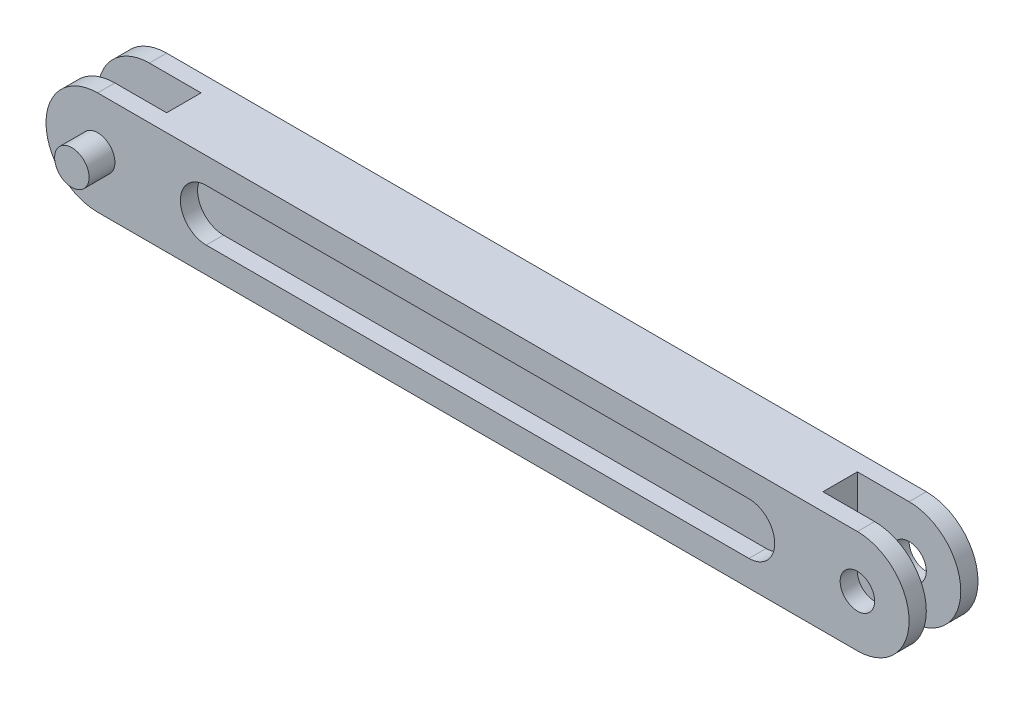
ISO-10303-21;
HEADER;
FILE_DESCRIPTION(('STEP AP214'),'2;1');
FILE_NAME('part.step','',(''),(''),'','','');
FILE_SCHEMA(('AUTOMOTIVE_DESIGN { 1 0 10303 214 1 1 1 1 }'));
ENDSEC;
DATA;
#1=APPLICATION_CONTEXT('core data for automotive mechanical design processes');
#2=APPLICATION_PROTOCOL_DEFINITION('international standard','automotive_design',2000,#1);
#3=PRODUCT_CONTEXT('',#1,'mechanical');
#4=PRODUCT('Part','Part','',(#3));
#5=PRODUCT_RELATED_PRODUCT_CATEGORY('part','',(#4));
#6=PRODUCT_DEFINITION_FORMATION('','',#4);
#7=PRODUCT_DEFINITION_CONTEXT('part definition',#1,'design');
#8=PRODUCT_DEFINITION('design','',#6,#7);
#9=PRODUCT_DEFINITION_SHAPE('','',#8);
#10=(LENGTH_UNIT() NAMED_UNIT(*) SI_UNIT(.MILLI.,.METRE.));
#11=(NAMED_UNIT(*) PLANE_ANGLE_UNIT() SI_UNIT($,.RADIAN.));
#12=(NAMED_UNIT(*) SI_UNIT($,.STERADIAN.) SOLID_ANGLE_UNIT());
#13=UNCERTAINTY_MEASURE_WITH_UNIT(LENGTH_MEASURE(1.E-05),#10,'distance_accuracy_value','');
#14=(GEOMETRIC_REPRESENTATION_CONTEXT(3) GLOBAL_UNCERTAINTY_ASSIGNED_CONTEXT((#13)) GLOBAL_UNIT_ASSIGNED_CONTEXT((#10,
#11,#12)) REPRESENTATION_CONTEXT('',''));
#15=CARTESIAN_POINT('',(0.,0.,0.));
#16=DIRECTION('',(0.,0.,1.));
#17=DIRECTION('',(1.,0.,0.));
#18=AXIS2_PLACEMENT_3D('',#15,#16,#17);
#19=CARTESIAN_POINT('',(0.,-19.05,25.4));
#20=DIRECTION('',(0.,1.,0.));
#21=DIRECTION('',(0.,0.,1.));
#22=AXIS2_PLACEMENT_3D('',#19,#20,#21);
#23=PLANE('',#22);
#24=DIRECTION('',(1.,0.,0.));
#25=VECTOR('',#24,1.);
#26=CARTESIAN_POINT('',(260.95,-19.05,19.05));
#27=LINE('',#26,#25);
#28=CARTESIAN_POINT('',(260.95,-19.05,19.05));
#29=VERTEX_POINT('',#28);
#30=CARTESIAN_POINT('',(280.,-19.05,19.05));
#31=VERTEX_POINT('',#30);
#32=EDGE_CURVE('E332',#29,#31,#27,.T.);
#33=ORIENTED_EDGE('',*,*,#32,.T.);
#34=DIRECTION('',(0.,0.,-1.));
#35=VECTOR('',#34,1.);
#36=CARTESIAN_POINT('',(280.,-19.05,25.4));
#37=LINE('',#36,#35);
#38=CARTESIAN_POINT('',(280.,-19.05,25.4));
#39=VERTEX_POINT('',#38);
#40=EDGE_CURVE('E329',#39,#31,#37,.T.);
#41=ORIENTED_EDGE('',*,*,#40,.F.);
#42=DIRECTION('',(1.,0.,0.));
#43=VECTOR('',#42,1.);
#44=CARTESIAN_POINT('',(0.,-19.05,25.4));
#45=LINE('',#44,#43);
#46=CARTESIAN_POINT('',(0.,-19.05,25.4));
#47=VERTEX_POINT('',#46);
#48=EDGE_CURVE('E305',#47,#39,#45,.T.);
#49=ORIENTED_EDGE('',*,*,#48,.F.);
#50=DIRECTION('',(0.,0.,-1.));
#51=VECTOR('',#50,1.);
#52=CARTESIAN_POINT('',(0.,-19.05,25.4));
#53=LINE('',#52,#51);
#54=CARTESIAN_POINT('',(0.,-19.05,19.05));
#55=VERTEX_POINT('',#54);
#56=EDGE_CURVE('E11',#47,#55,#53,.T.);
#57=ORIENTED_EDGE('',*,*,#56,.T.);
#58=DIRECTION('',(-1.,0.,0.));
#59=VECTOR('',#58,1.);
#60=CARTESIAN_POINT('',(19.05,-19.05,19.05));
#61=LINE('',#60,#59);
#62=CARTESIAN_POINT('',(19.05,-19.05,19.05));
#63=VERTEX_POINT('',#62);
#64=EDGE_CURVE('E213',#63,#55,#61,.T.);
#65=ORIENTED_EDGE('',*,*,#64,.F.);
#66=DIRECTION('',(0.,0.,1.));
#67=VECTOR('',#66,1.);
#68=CARTESIAN_POINT('',(19.05,-19.05,6.35));
#69=LINE('',#68,#67);
#70=CARTESIAN_POINT('',(19.05,-19.05,6.35));
#71=VERTEX_POINT('',#70);
#72=EDGE_CURVE('E205',#71,#63,#69,.T.);
#73=ORIENTED_EDGE('',*,*,#72,.F.);
#74=DIRECTION('',(-1.,0.,0.));
#75=VECTOR('',#74,1.);
#76=CARTESIAN_POINT('',(19.05,-19.05,6.35));
#77=LINE('',#76,#75);
#78=CARTESIAN_POINT('',(0.,-19.05,6.35));
#79=VERTEX_POINT('',#78);
#80=EDGE_CURVE('E214',#71,#79,#77,.T.);
#81=ORIENTED_EDGE('',*,*,#80,.T.);
#82=CARTESIAN_POINT('',(0.,-19.05,0.));
#83=VERTEX_POINT('',#82);
#84=EDGE_CURVE('E44',#79,#83,#53,.T.);
#85=ORIENTED_EDGE('',*,*,#84,.T.);
#86=DIRECTION('',(1.,0.,0.));
#87=VECTOR('',#86,1.);
#88=CARTESIAN_POINT('',(0.,-19.05,0.));
#89=LINE('',#88,#87);
#90=CARTESIAN_POINT('',(280.,-19.05,0.));
#91=VERTEX_POINT('',#90);
#92=EDGE_CURVE('E315',#83,#91,#89,.T.);
#93=ORIENTED_EDGE('',*,*,#92,.T.);
#94=CARTESIAN_POINT('',(280.,-19.05,6.35));
#95=VERTEX_POINT('',#94);
#96=EDGE_CURVE('E193',#95,#91,#37,.T.);
#97=ORIENTED_EDGE('',*,*,#96,.F.);
#98=DIRECTION('',(1.,0.,0.));
#99=VECTOR('',#98,1.);
#100=CARTESIAN_POINT('',(260.95,-19.05,6.35));
#101=LINE('',#100,#99);
#102=CARTESIAN_POINT('',(260.95,-19.05,6.35));
#103=VERTEX_POINT('',#102);
#104=EDGE_CURVE('E175',#103,#95,#101,.T.);
#105=ORIENTED_EDGE('',*,*,#104,.F.);
#106=DIRECTION('',(0.,0.,1.));
#107=VECTOR('',#106,1.);
#108=CARTESIAN_POINT('',(260.95,-19.05,6.35));
#109=LINE('',#108,#107);
#110=EDGE_CURVE('E181',#103,#29,#109,.T.);
#111=ORIENTED_EDGE('',*,*,#110,.T.);
#112=EDGE_LOOP('',(#33,#41,#49,#57,#65,#73,#81,#85,#93,#97,#105,#111));
#113=FACE_BOUND('',#112,.T.);
#114=ADVANCED_FACE('F35',(#113),#23,.F.);
#115=CARTESIAN_POINT('',(280.,0.,25.4));
#116=DIRECTION('',(0.,0.,-1.));
#117=DIRECTION('',(-1.,0.,0.));
#118=AXIS2_PLACEMENT_3D('',#115,#116,#117);
#119=CYLINDRICAL_SURFACE('',#118,19.05);
#120=CARTESIAN_POINT('',(280.,0.,19.05));
#121=DIRECTION('',(0.,0.,-1.));
#122=DIRECTION('',(-1.,0.,0.));
#123=AXIS2_PLACEMENT_3D('',#120,#121,#122);
#124=CIRCLE('',#123,19.05);
#125=CARTESIAN_POINT('',(280.,19.05,19.05));
#126=VERTEX_POINT('',#125);
#127=EDGE_CURVE('E203',#126,#31,#124,.T.);
#128=ORIENTED_EDGE('',*,*,#127,.F.);
#129=DIRECTION('',(0.,0.,-1.));
#130=VECTOR('',#129,1.);
#131=CARTESIAN_POINT('',(280.,19.05,25.4));
#132=LINE('',#131,#130);
#133=CARTESIAN_POINT('',(280.,19.05,25.4));
#134=VERTEX_POINT('',#133);
#135=EDGE_CURVE('E326',#134,#126,#132,.T.);
#136=ORIENTED_EDGE('',*,*,#135,.F.);
#137=CARTESIAN_POINT('',(280.,0.,25.4));
#138=DIRECTION('',(0.,0.,1.));
#139=DIRECTION('',(1.,0.,0.));
#140=AXIS2_PLACEMENT_3D('',#137,#138,#139);
#141=CIRCLE('',#140,19.05);
#142=EDGE_CURVE('E308',#39,#134,#141,.T.);
#143=ORIENTED_EDGE('',*,*,#142,.F.);
#144=ORIENTED_EDGE('',*,*,#40,.T.);
#145=EDGE_LOOP('',(#128,#136,#143,#144));
#146=FACE_BOUND('',#145,.T.);
#147=ADVANCED_FACE('F374',(#146),#119,.T.);
#148=CARTESIAN_POINT('',(280.,0.,6.35));
#149=DIRECTION('',(0.,0.,1.));
#150=DIRECTION('',(0.,-1.,0.));
#151=AXIS2_PLACEMENT_3D('',#148,#149,#150);
#152=CIRCLE('',#151,19.05);
#153=CARTESIAN_POINT('',(280.,19.05,6.35));
#154=VERTEX_POINT('',#153);
#155=EDGE_CURVE('E200',#95,#154,#152,.T.);
#156=ORIENTED_EDGE('',*,*,#155,.F.);
#157=ORIENTED_EDGE('',*,*,#96,.T.);
#158=CARTESIAN_POINT('',(280.,0.,0.));
#159=DIRECTION('',(0.,0.,1.));
#160=DIRECTION('',(1.,0.,0.));
#161=AXIS2_PLACEMENT_3D('',#158,#159,#160);
#162=CIRCLE('',#161,19.05);
#163=CARTESIAN_POINT('',(280.,19.05,0.));
#164=VERTEX_POINT('',#163);
#165=EDGE_CURVE('E317',#91,#164,#162,.T.);
#166=ORIENTED_EDGE('',*,*,#165,.T.);
#167=EDGE_CURVE('E325',#154,#164,#132,.T.);
#168=ORIENTED_EDGE('',*,*,#167,.F.);
#169=EDGE_LOOP('',(#156,#157,#166,#168));
#170=FACE_BOUND('',#169,.T.);
#171=ADVANCED_FACE('F379',(#170),#119,.T.);
#172=CARTESIAN_POINT('',(0.,19.05,25.4));
#173=DIRECTION('',(0.,-1.,0.));
#174=DIRECTION('',(0.,0.,-1.));
#175=AXIS2_PLACEMENT_3D('',#172,#173,#174);
#176=PLANE('',#175);
#177=DIRECTION('',(1.,0.,0.));
#178=VECTOR('',#177,1.);
#179=CARTESIAN_POINT('',(260.95,19.05,19.05));
#180=LINE('',#179,#178);
#181=CARTESIAN_POINT('',(260.95,19.05,19.05));
#182=VERTEX_POINT('',#181);
#183=EDGE_CURVE('E195',#182,#126,#180,.T.);
#184=ORIENTED_EDGE('',*,*,#183,.F.);
#185=DIRECTION('',(0.,0.,-1.));
#186=VECTOR('',#185,1.);
#187=CARTESIAN_POINT('',(260.95,19.05,6.35));
#188=LINE('',#187,#186);
#189=CARTESIAN_POINT('',(260.95,19.05,6.35));
#190=VERTEX_POINT('',#189);
#191=EDGE_CURVE('E180',#182,#190,#188,.T.);
#192=ORIENTED_EDGE('',*,*,#191,.T.);
#193=DIRECTION('',(1.,0.,0.));
#194=VECTOR('',#193,1.);
#195=CARTESIAN_POINT('',(260.95,19.05,6.35));
#196=LINE('',#195,#194);
#197=EDGE_CURVE('E178',#190,#154,#196,.T.);
#198=ORIENTED_EDGE('',*,*,#197,.T.);
#199=ORIENTED_EDGE('',*,*,#167,.T.);
#200=DIRECTION('',(-1.,0.,0.));
#201=VECTOR('',#200,1.);
#202=CARTESIAN_POINT('',(0.,19.05,0.));
#203=LINE('',#202,#201);
#204=CARTESIAN_POINT('',(0.,19.05,0.));
#205=VERTEX_POINT('',#204);
#206=EDGE_CURVE('E306',#164,#205,#203,.T.);
#207=ORIENTED_EDGE('',*,*,#206,.T.);
#208=DIRECTION('',(0.,0.,-1.));
#209=VECTOR('',#208,1.);
#210=CARTESIAN_POINT('',(0.,19.05,25.4));
#211=LINE('',#210,#209);
#212=CARTESIAN_POINT('',(0.,19.05,6.35));
#213=VERTEX_POINT('',#212);
#214=EDGE_CURVE('E312',#213,#205,#211,.T.);
#215=ORIENTED_EDGE('',*,*,#214,.F.);
#216=DIRECTION('',(-1.,0.,0.));
#217=VECTOR('',#216,1.);
#218=CARTESIAN_POINT('',(19.05,19.05,6.35));
#219=LINE('',#218,#217);
#220=CARTESIAN_POINT('',(19.05,19.05,6.35));
#221=VERTEX_POINT('',#220);
#222=EDGE_CURVE('E218',#221,#213,#219,.T.);
#223=ORIENTED_EDGE('',*,*,#222,.F.);
#224=DIRECTION('',(0.,0.,-1.));
#225=VECTOR('',#224,1.);
#226=CARTESIAN_POINT('',(19.05,19.05,6.35));
#227=LINE('',#226,#225);
#228=CARTESIAN_POINT('',(19.05,19.05,19.05));
#229=VERTEX_POINT('',#228);
#230=EDGE_CURVE('E208',#229,#221,#227,.T.);
#231=ORIENTED_EDGE('',*,*,#230,.F.);
#232=DIRECTION('',(-1.,0.,0.));
#233=VECTOR('',#232,1.);
#234=CARTESIAN_POINT('',(19.05,19.05,19.05));
#235=LINE('',#234,#233);
#236=CARTESIAN_POINT('',(0.,19.05,19.05));
#237=VERTEX_POINT('',#236);
#238=EDGE_CURVE('E221',#229,#237,#235,.T.);
#239=ORIENTED_EDGE('',*,*,#238,.T.);
#240=CARTESIAN_POINT('',(0.,19.05,25.4));
#241=VERTEX_POINT('',#240);
#242=EDGE_CURVE('E322',#241,#237,#211,.T.);
#243=ORIENTED_EDGE('',*,*,#242,.F.);
#244=DIRECTION('',(-1.,0.,0.));
#245=VECTOR('',#244,1.);
#246=CARTESIAN_POINT('',(0.,19.05,25.4));
#247=LINE('',#246,#245);
#248=EDGE_CURVE('E310',#134,#241,#247,.T.);
#249=ORIENTED_EDGE('',*,*,#248,.F.);
#250=ORIENTED_EDGE('',*,*,#135,.T.);
#251=EDGE_LOOP('',(#184,#192,#198,#199,#207,#215,#223,#231,#239,#243,#249,#250));
#252=FACE_BOUND('',#251,.T.);
#253=ADVANCED_FACE('F383',(#252),#176,.F.);
#254=CARTESIAN_POINT('',(280.,0.,25.4));
#255=DIRECTION('',(0.,0.,-1.));
#256=DIRECTION('',(-1.,0.,0.));
#257=AXIS2_PLACEMENT_3D('',#254,#255,#256);
#258=CYLINDRICAL_SURFACE('',#257,6.35);
#259=CARTESIAN_POINT('',(280.,0.,25.4));
#260=DIRECTION('',(0.,0.,1.));
#261=DIRECTION('',(1.,0.,0.));
#262=AXIS2_PLACEMENT_3D('',#259,#260,#261);
#263=CIRCLE('',#262,6.35);
#264=CARTESIAN_POINT('',(286.35,0.,25.4));
#265=VERTEX_POINT('',#264);
#266=EDGE_CURVE('E293',#265,#265,#263,.T.);
#267=ORIENTED_EDGE('',*,*,#266,.T.);
#268=EDGE_LOOP('',(#267));
#269=FACE_BOUND('',#268,.T.);
#270=CARTESIAN_POINT('',(280.,0.,19.05));
#271=DIRECTION('',(0.,0.,-1.));
#272=DIRECTION('',(-1.,0.,0.));
#273=AXIS2_PLACEMENT_3D('',#270,#271,#272);
#274=CIRCLE('',#273,6.35);
#275=CARTESIAN_POINT('',(273.65,0.,19.05));
#276=VERTEX_POINT('',#275);
#277=EDGE_CURVE('E39',#276,#276,#274,.T.);
#278=ORIENTED_EDGE('',*,*,#277,.T.);
#279=EDGE_LOOP('',(#278));
#280=FACE_BOUND('',#279,.T.);
#281=ADVANCED_FACE('F386',(#269,#280),#258,.F.);
#282=CARTESIAN_POINT('',(280.,0.,0.));
#283=DIRECTION('',(0.,0.,1.));
#284=DIRECTION('',(1.,0.,0.));
#285=AXIS2_PLACEMENT_3D('',#282,#283,#284);
#286=CIRCLE('',#285,6.35);
#287=CARTESIAN_POINT('',(286.35,0.,0.));
#288=VERTEX_POINT('',#287);
#289=EDGE_CURVE('E286',#288,#288,#286,.T.);
#290=ORIENTED_EDGE('',*,*,#289,.F.);
#291=EDGE_LOOP('',(#290));
#292=FACE_BOUND('',#291,.T.);
#293=CARTESIAN_POINT('',(280.,0.,6.35));
#294=DIRECTION('',(0.,0.,1.));
#295=DIRECTION('',(0.,-1.,0.));
#296=AXIS2_PLACEMENT_3D('',#293,#294,#295);
#297=CIRCLE('',#296,6.35);
#298=CARTESIAN_POINT('',(280.,-6.35,6.35));
#299=VERTEX_POINT('',#298);
#300=EDGE_CURVE('E202',#299,#299,#297,.T.);
#301=ORIENTED_EDGE('',*,*,#300,.T.);
#302=EDGE_LOOP('',(#301));
#303=FACE_BOUND('',#302,.T.);
#304=ADVANCED_FACE('F399',(#292,#303),#258,.F.);
#305=CARTESIAN_POINT('',(0.,0.,25.4));
#306=DIRECTION('',(0.,0.,-1.));
#307=DIRECTION('',(-1.,0.,0.));
#308=AXIS2_PLACEMENT_3D('',#305,#306,#307);
#309=CYLINDRICAL_SURFACE('',#308,19.05);
#310=ORIENTED_EDGE('',*,*,#242,.T.);
#311=CARTESIAN_POINT('',(0.,0.,19.05));
#312=DIRECTION('',(0.,0.,1.));
#313=DIRECTION('',(1.,0.,0.));
#314=AXIS2_PLACEMENT_3D('',#311,#312,#313);
#315=CIRCLE('',#314,19.05);
#316=EDGE_CURVE('E217',#237,#55,#315,.T.);
#317=ORIENTED_EDGE('',*,*,#316,.T.);
#318=ORIENTED_EDGE('',*,*,#56,.F.);
#319=CARTESIAN_POINT('',(0.,0.,25.4));
#320=DIRECTION('',(0.,0.,1.));
#321=DIRECTION('',(1.,0.,0.));
#322=AXIS2_PLACEMENT_3D('',#319,#320,#321);
#323=CIRCLE('',#322,19.05);
#324=EDGE_CURVE('E302',#241,#47,#323,.T.);
#325=ORIENTED_EDGE('',*,*,#324,.F.);
#326=EDGE_LOOP('',(#310,#317,#318,#325));
#327=FACE_BOUND('',#326,.T.);
#328=ADVANCED_FACE('F392',(#327),#309,.T.);
#329=CARTESIAN_POINT('',(0.,0.,0.));
#330=DIRECTION('',(0.,0.,1.));
#331=DIRECTION('',(1.,0.,0.));
#332=AXIS2_PLACEMENT_3D('',#329,#330,#331);
#333=PLANE('',#332);
#334=ORIENTED_EDGE('',*,*,#289,.T.);
#335=EDGE_LOOP('',(#334));
#336=FACE_BOUND('',#335,.T.);
#337=CARTESIAN_POINT('',(0.,0.,0.));
#338=DIRECTION('',(0.,0.,1.));
#339=DIRECTION('',(1.,0.,0.));
#340=AXIS2_PLACEMENT_3D('',#337,#338,#339);
#341=CIRCLE('',#340,6.35);
#342=CARTESIAN_POINT('',(6.35,0.,0.));
#343=VERTEX_POINT('',#342);
#344=EDGE_CURVE('E189',#343,#343,#341,.T.);
#345=ORIENTED_EDGE('',*,*,#344,.T.);
#346=EDGE_LOOP('',(#345));
#347=FACE_BOUND('',#346,.T.);
#348=CARTESIAN_POINT('',(0.,0.,0.));
#349=DIRECTION('',(0.,0.,1.));
#350=DIRECTION('',(1.,0.,0.));
#351=AXIS2_PLACEMENT_3D('',#348,#349,#350);
#352=CIRCLE('',#351,19.05);
#353=EDGE_CURVE('E301',#205,#83,#352,.T.);
#354=ORIENTED_EDGE('',*,*,#353,.F.);
#355=ORIENTED_EDGE('',*,*,#206,.F.);
#356=ORIENTED_EDGE('',*,*,#165,.F.);
#357=ORIENTED_EDGE('',*,*,#92,.F.);
#358=EDGE_LOOP('',(#354,#355,#356,#357));
#359=FACE_BOUND('',#358,.T.);
#360=CARTESIAN_POINT('',(40.,0.,0.));
#361=DIRECTION('',(0.,0.,1.));
#362=DIRECTION('',(1.,0.,0.));
#363=AXIS2_PLACEMENT_3D('',#360,#361,#362);
#364=CIRCLE('',#363,9.525);
#365=CARTESIAN_POINT('',(40.,9.525,0.));
#366=VERTEX_POINT('',#365);
#367=CARTESIAN_POINT('',(40.,-9.525,0.));
#368=VERTEX_POINT('',#367);
#369=EDGE_CURVE('E229',#366,#368,#364,.T.);
#370=ORIENTED_EDGE('',*,*,#369,.T.);
#371=DIRECTION('',(1.,0.,0.));
#372=VECTOR('',#371,1.);
#373=CARTESIAN_POINT('',(40.,-9.525,0.));
#374=LINE('',#373,#372);
#375=CARTESIAN_POINT('',(240.,-9.525,0.));
#376=VERTEX_POINT('',#375);
#377=EDGE_CURVE('E234',#368,#376,#374,.T.);
#378=ORIENTED_EDGE('',*,*,#377,.T.);
#379=CARTESIAN_POINT('',(240.,0.,0.));
#380=DIRECTION('',(0.,0.,1.));
#381=DIRECTION('',(1.,0.,0.));
#382=AXIS2_PLACEMENT_3D('',#379,#380,#381);
#383=CIRCLE('',#382,9.525);
#384=CARTESIAN_POINT('',(240.,9.525,0.));
#385=VERTEX_POINT('',#384);
#386=EDGE_CURVE('E246',#376,#385,#383,.T.);
#387=ORIENTED_EDGE('',*,*,#386,.T.);
#388=DIRECTION('',(-1.,0.,0.));
#389=VECTOR('',#388,1.);
#390=CARTESIAN_POINT('',(40.,9.525,0.));
#391=LINE('',#390,#389);
#392=EDGE_CURVE('E243',#385,#366,#391,.T.);
#393=ORIENTED_EDGE('',*,*,#392,.T.);
#394=EDGE_LOOP('',(#370,#378,#387,#393));
#395=FACE_BOUND('',#394,.T.);
#396=ADVANCED_FACE('F388',(#336,#347,#359,#395),#333,.F.);
#397=CARTESIAN_POINT('',(0.,0.,25.4));
#398=DIRECTION('',(0.,0.,1.));
#399=DIRECTION('',(1.,0.,0.));
#400=AXIS2_PLACEMENT_3D('',#397,#398,#399);
#401=PLANE('',#400);
#402=CARTESIAN_POINT('',(40.,0.,25.4));
#403=DIRECTION('',(0.,0.,1.));
#404=DIRECTION('',(1.,0.,0.));
#405=AXIS2_PLACEMENT_3D('',#402,#403,#404);
#406=CIRCLE('',#405,9.525);
#407=CARTESIAN_POINT('',(40.,9.525,25.4));
#408=VERTEX_POINT('',#407);
#409=CARTESIAN_POINT('',(40.,-9.525,25.4));
#410=VERTEX_POINT('',#409);
#411=EDGE_CURVE('E254',#408,#410,#406,.T.);
#412=ORIENTED_EDGE('',*,*,#411,.F.);
#413=DIRECTION('',(-1.,0.,0.));
#414=VECTOR('',#413,1.);
#415=CARTESIAN_POINT('',(40.,9.525,25.4));
#416=LINE('',#415,#414);
#417=CARTESIAN_POINT('',(240.,9.525,25.4));
#418=VERTEX_POINT('',#417);
#419=EDGE_CURVE('E265',#418,#408,#416,.T.);
#420=ORIENTED_EDGE('',*,*,#419,.F.);
#421=CARTESIAN_POINT('',(240.,0.,25.4));
#422=DIRECTION('',(0.,0.,1.));
#423=DIRECTION('',(1.,0.,0.));
#424=AXIS2_PLACEMENT_3D('',#421,#422,#423);
#425=CIRCLE('',#424,9.525);
#426=CARTESIAN_POINT('',(240.,-9.525,25.4));
#427=VERTEX_POINT('',#426);
#428=EDGE_CURVE('E279',#427,#418,#425,.T.);
#429=ORIENTED_EDGE('',*,*,#428,.F.);
#430=DIRECTION('',(1.,0.,0.));
#431=VECTOR('',#430,1.);
#432=CARTESIAN_POINT('',(40.,-9.525,25.4));
#433=LINE('',#432,#431);
#434=EDGE_CURVE('E276',#410,#427,#433,.T.);
#435=ORIENTED_EDGE('',*,*,#434,.F.);
#436=EDGE_LOOP('',(#412,#420,#429,#435));
#437=FACE_BOUND('',#436,.T.);
#438=CARTESIAN_POINT('',(0.,0.,25.4));
#439=DIRECTION('',(0.,0.,1.));
#440=DIRECTION('',(1.,0.,0.));
#441=AXIS2_PLACEMENT_3D('',#438,#439,#440);
#442=CIRCLE('',#441,6.35);
#443=CARTESIAN_POINT('',(6.35,0.,25.4));
#444=VERTEX_POINT('',#443);
#445=EDGE_CURVE('E296',#444,#444,#442,.T.);
#446=ORIENTED_EDGE('',*,*,#445,.F.);
#447=EDGE_LOOP('',(#446));
#448=FACE_BOUND('',#447,.T.);
#449=ORIENTED_EDGE('',*,*,#324,.T.);
#450=ORIENTED_EDGE('',*,*,#48,.T.);
#451=ORIENTED_EDGE('',*,*,#142,.T.);
#452=ORIENTED_EDGE('',*,*,#248,.T.);
#453=EDGE_LOOP('',(#449,#450,#451,#452));
#454=FACE_BOUND('',#453,.T.);
#455=ORIENTED_EDGE('',*,*,#266,.F.);
#456=EDGE_LOOP('',(#455));
#457=FACE_BOUND('',#456,.T.);
#458=ADVANCED_FACE('F391',(#437,#448,#454,#457),#401,.T.);
#459=ORIENTED_EDGE('',*,*,#84,.F.);
#460=CARTESIAN_POINT('',(0.,0.,6.35));
#461=DIRECTION('',(0.,0.,-1.));
#462=DIRECTION('',(0.,1.,0.));
#463=AXIS2_PLACEMENT_3D('',#460,#461,#462);
#464=CIRCLE('',#463,19.05);
#465=EDGE_CURVE('E227',#79,#213,#464,.T.);
#466=ORIENTED_EDGE('',*,*,#465,.T.);
#467=ORIENTED_EDGE('',*,*,#214,.T.);
#468=ORIENTED_EDGE('',*,*,#353,.T.);
#469=EDGE_LOOP('',(#459,#466,#467,#468));
#470=FACE_BOUND('',#469,.T.);
#471=ADVANCED_FACE('F37',(#470),#309,.T.);
#472=CARTESIAN_POINT('',(40.,0.,19.05));
#473=DIRECTION('',(0.,0.,1.));
#474=DIRECTION('',(1.,0.,0.));
#475=AXIS2_PLACEMENT_3D('',#472,#473,#474);
#476=CYLINDRICAL_SURFACE('',#475,9.525);
#477=ORIENTED_EDGE('',*,*,#411,.T.);
#478=DIRECTION('',(0.,0.,1.));
#479=VECTOR('',#478,1.);
#480=CARTESIAN_POINT('',(40.,-9.525,19.05));
#481=LINE('',#480,#479);
#482=CARTESIAN_POINT('',(40.,-9.525,19.05));
#483=VERTEX_POINT('',#482);
#484=EDGE_CURVE('E274',#483,#410,#481,.T.);
#485=ORIENTED_EDGE('',*,*,#484,.F.);
#486=CARTESIAN_POINT('',(40.,0.,19.05));
#487=DIRECTION('',(0.,0.,1.));
#488=DIRECTION('',(1.,0.,0.));
#489=AXIS2_PLACEMENT_3D('',#486,#487,#488);
#490=CIRCLE('',#489,9.525);
#491=CARTESIAN_POINT('',(40.,9.525,19.05));
#492=VERTEX_POINT('',#491);
#493=EDGE_CURVE('E261',#492,#483,#490,.T.);
#494=ORIENTED_EDGE('',*,*,#493,.F.);
#495=DIRECTION('',(0.,0.,1.));
#496=VECTOR('',#495,1.);
#497=CARTESIAN_POINT('',(40.,9.525,19.05));
#498=LINE('',#497,#496);
#499=EDGE_CURVE('E284',#492,#408,#498,.T.);
#500=ORIENTED_EDGE('',*,*,#499,.T.);
#501=EDGE_LOOP('',(#477,#485,#494,#500));
#502=FACE_BOUND('',#501,.T.);
#503=ADVANCED_FACE('F401',(#502),#476,.F.);
#504=CARTESIAN_POINT('',(40.,9.525,19.05));
#505=DIRECTION('',(0.,1.,0.));
#506=DIRECTION('',(0.,0.,1.));
#507=AXIS2_PLACEMENT_3D('',#504,#505,#506);
#508=PLANE('',#507);
#509=ORIENTED_EDGE('',*,*,#419,.T.);
#510=ORIENTED_EDGE('',*,*,#499,.F.);
#511=DIRECTION('',(-1.,0.,0.));
#512=VECTOR('',#511,1.);
#513=CARTESIAN_POINT('',(40.,9.525,19.05));
#514=LINE('',#513,#512);
#515=CARTESIAN_POINT('',(240.,9.525,19.05));
#516=VERTEX_POINT('',#515);
#517=EDGE_CURVE('E271',#516,#492,#514,.T.);
#518=ORIENTED_EDGE('',*,*,#517,.F.);
#519=DIRECTION('',(0.,0.,1.));
#520=VECTOR('',#519,1.);
#521=CARTESIAN_POINT('',(240.,9.525,19.05));
#522=LINE('',#521,#520);
#523=EDGE_CURVE('E287',#516,#418,#522,.T.);
#524=ORIENTED_EDGE('',*,*,#523,.T.);
#525=EDGE_LOOP('',(#509,#510,#518,#524));
#526=FACE_BOUND('',#525,.T.);
#527=ADVANCED_FACE('F404',(#526),#508,.F.);
#528=CARTESIAN_POINT('',(240.,0.,19.05));
#529=DIRECTION('',(0.,0.,1.));
#530=DIRECTION('',(1.,0.,0.));
#531=AXIS2_PLACEMENT_3D('',#528,#529,#530);
#532=CYLINDRICAL_SURFACE('',#531,9.525);
#533=ORIENTED_EDGE('',*,*,#428,.T.);
#534=ORIENTED_EDGE('',*,*,#523,.F.);
#535=CARTESIAN_POINT('',(240.,0.,19.05));
#536=DIRECTION('',(0.,0.,1.));
#537=DIRECTION('',(1.,0.,0.));
#538=AXIS2_PLACEMENT_3D('',#535,#536,#537);
#539=CIRCLE('',#538,9.525);
#540=CARTESIAN_POINT('',(240.,-9.525,19.05));
#541=VERTEX_POINT('',#540);
#542=EDGE_CURVE('E268',#541,#516,#539,.T.);
#543=ORIENTED_EDGE('',*,*,#542,.F.);
#544=DIRECTION('',(0.,0.,1.));
#545=VECTOR('',#544,1.);
#546=CARTESIAN_POINT('',(240.,-9.525,19.05));
#547=LINE('',#546,#545);
#548=EDGE_CURVE('E289',#541,#427,#547,.T.);
#549=ORIENTED_EDGE('',*,*,#548,.T.);
#550=EDGE_LOOP('',(#533,#534,#543,#549));
#551=FACE_BOUND('',#550,.T.);
#552=ADVANCED_FACE('F410',(#551),#532,.F.);
#553=CARTESIAN_POINT('',(40.,-9.525,19.05));
#554=DIRECTION('',(0.,-1.,0.));
#555=DIRECTION('',(0.,0.,-1.));
#556=AXIS2_PLACEMENT_3D('',#553,#554,#555);
#557=PLANE('',#556);
#558=ORIENTED_EDGE('',*,*,#434,.T.);
#559=ORIENTED_EDGE('',*,*,#548,.F.);
#560=DIRECTION('',(1.,0.,0.));
#561=VECTOR('',#560,1.);
#562=CARTESIAN_POINT('',(40.,-9.525,19.05));
#563=LINE('',#562,#561);
#564=EDGE_CURVE('E264',#483,#541,#563,.T.);
#565=ORIENTED_EDGE('',*,*,#564,.F.);
#566=ORIENTED_EDGE('',*,*,#484,.T.);
#567=EDGE_LOOP('',(#558,#559,#565,#566));
#568=FACE_BOUND('',#567,.T.);
#569=ADVANCED_FACE('F406',(#568),#557,.F.);
#570=CARTESIAN_POINT('',(40.,0.,19.05));
#571=DIRECTION('',(0.,0.,1.));
#572=DIRECTION('',(1.,0.,0.));
#573=AXIS2_PLACEMENT_3D('',#570,#571,#572);
#574=PLANE('',#573);
#575=ORIENTED_EDGE('',*,*,#493,.T.);
#576=ORIENTED_EDGE('',*,*,#564,.T.);
#577=ORIENTED_EDGE('',*,*,#542,.T.);
#578=ORIENTED_EDGE('',*,*,#517,.T.);
#579=EDGE_LOOP('',(#575,#576,#577,#578));
#580=FACE_BOUND('',#579,.T.);
#581=ADVANCED_FACE('F409',(#580),#574,.T.);
#582=CARTESIAN_POINT('',(40.,0.,6.35));
#583=DIRECTION('',(0.,0.,-1.));
#584=DIRECTION('',(-1.,0.,0.));
#585=AXIS2_PLACEMENT_3D('',#582,#583,#584);
#586=CYLINDRICAL_SURFACE('',#585,9.525);
#587=ORIENTED_EDGE('',*,*,#369,.F.);
#588=DIRECTION('',(0.,0.,-1.));
#589=VECTOR('',#588,1.);
#590=CARTESIAN_POINT('',(40.,9.525,6.35));
#591=LINE('',#590,#589);
#592=CARTESIAN_POINT('',(40.,9.525,6.35));
#593=VERTEX_POINT('',#592);
#594=EDGE_CURVE('E240',#593,#366,#591,.T.);
#595=ORIENTED_EDGE('',*,*,#594,.F.);
#596=CARTESIAN_POINT('',(40.,0.,6.35));
#597=DIRECTION('',(0.,0.,1.));
#598=DIRECTION('',(1.,0.,0.));
#599=AXIS2_PLACEMENT_3D('',#596,#597,#598);
#600=CIRCLE('',#599,9.525);
#601=CARTESIAN_POINT('',(40.,-9.525,6.35));
#602=VERTEX_POINT('',#601);
#603=EDGE_CURVE('E230',#593,#602,#600,.T.);
#604=ORIENTED_EDGE('',*,*,#603,.T.);
#605=DIRECTION('',(0.,0.,-1.));
#606=VECTOR('',#605,1.);
#607=CARTESIAN_POINT('',(40.,-9.525,6.35));
#608=LINE('',#607,#606);
#609=EDGE_CURVE('E251',#602,#368,#608,.T.);
#610=ORIENTED_EDGE('',*,*,#609,.T.);
#611=EDGE_LOOP('',(#587,#595,#604,#610));
#612=FACE_BOUND('',#611,.T.);
#613=ADVANCED_FACE('F420',(#612),#586,.F.);
#614=CARTESIAN_POINT('',(40.,-9.525,6.35));
#615=DIRECTION('',(0.,1.,0.));
#616=DIRECTION('',(0.,0.,1.));
#617=AXIS2_PLACEMENT_3D('',#614,#615,#616);
#618=PLANE('',#617);
#619=ORIENTED_EDGE('',*,*,#377,.F.);
#620=ORIENTED_EDGE('',*,*,#609,.F.);
#621=DIRECTION('',(1.,0.,0.));
#622=VECTOR('',#621,1.);
#623=CARTESIAN_POINT('',(40.,-9.525,6.35));
#624=LINE('',#623,#622);
#625=CARTESIAN_POINT('',(240.,-9.525,6.35));
#626=VERTEX_POINT('',#625);
#627=EDGE_CURVE('E238',#602,#626,#624,.T.);
#628=ORIENTED_EDGE('',*,*,#627,.T.);
#629=DIRECTION('',(0.,0.,-1.));
#630=VECTOR('',#629,1.);
#631=CARTESIAN_POINT('',(240.,-9.525,6.35));
#632=LINE('',#631,#630);
#633=EDGE_CURVE('E255',#626,#376,#632,.T.);
#634=ORIENTED_EDGE('',*,*,#633,.T.);
#635=EDGE_LOOP('',(#619,#620,#628,#634));
#636=FACE_BOUND('',#635,.T.);
#637=ADVANCED_FACE('F424',(#636),#618,.T.);
#638=CARTESIAN_POINT('',(240.,0.,6.35));
#639=DIRECTION('',(0.,0.,-1.));
#640=DIRECTION('',(-1.,0.,0.));
#641=AXIS2_PLACEMENT_3D('',#638,#639,#640);
#642=CYLINDRICAL_SURFACE('',#641,9.525);
#643=ORIENTED_EDGE('',*,*,#386,.F.);
#644=ORIENTED_EDGE('',*,*,#633,.F.);
#645=CARTESIAN_POINT('',(240.,0.,6.35));
#646=DIRECTION('',(0.,0.,1.));
#647=DIRECTION('',(1.,0.,0.));
#648=AXIS2_PLACEMENT_3D('',#645,#646,#647);
#649=CIRCLE('',#648,9.525);
#650=CARTESIAN_POINT('',(240.,9.525,6.35));
#651=VERTEX_POINT('',#650);
#652=EDGE_CURVE('E236',#626,#651,#649,.T.);
#653=ORIENTED_EDGE('',*,*,#652,.T.);
#654=DIRECTION('',(0.,0.,-1.));
#655=VECTOR('',#654,1.);
#656=CARTESIAN_POINT('',(240.,9.525,6.35));
#657=LINE('',#656,#655);
#658=EDGE_CURVE('E257',#651,#385,#657,.T.);
#659=ORIENTED_EDGE('',*,*,#658,.T.);
#660=EDGE_LOOP('',(#643,#644,#653,#659));
#661=FACE_BOUND('',#660,.T.);
#662=ADVANCED_FACE('F430',(#661),#642,.F.);
#663=CARTESIAN_POINT('',(40.,9.525,6.35));
#664=DIRECTION('',(0.,-1.,0.));
#665=DIRECTION('',(0.,0.,-1.));
#666=AXIS2_PLACEMENT_3D('',#663,#664,#665);
#667=PLANE('',#666);
#668=ORIENTED_EDGE('',*,*,#392,.F.);
#669=ORIENTED_EDGE('',*,*,#658,.F.);
#670=DIRECTION('',(-1.,0.,0.));
#671=VECTOR('',#670,1.);
#672=CARTESIAN_POINT('',(40.,9.525,6.35));
#673=LINE('',#672,#671);
#674=EDGE_CURVE('E233',#651,#593,#673,.T.);
#675=ORIENTED_EDGE('',*,*,#674,.T.);
#676=ORIENTED_EDGE('',*,*,#594,.T.);
#677=EDGE_LOOP('',(#668,#669,#675,#676));
#678=FACE_BOUND('',#677,.T.);
#679=ADVANCED_FACE('F426',(#678),#667,.T.);
#680=CARTESIAN_POINT('',(40.,0.,6.35));
#681=DIRECTION('',(0.,0.,-1.));
#682=DIRECTION('',(1.,0.,0.));
#683=AXIS2_PLACEMENT_3D('',#680,#681,#682);
#684=PLANE('',#683);
#685=ORIENTED_EDGE('',*,*,#603,.F.);
#686=ORIENTED_EDGE('',*,*,#674,.F.);
#687=ORIENTED_EDGE('',*,*,#652,.F.);
#688=ORIENTED_EDGE('',*,*,#627,.F.);
#689=EDGE_LOOP('',(#685,#686,#687,#688));
#690=FACE_BOUND('',#689,.T.);
#691=ADVANCED_FACE('F429',(#690),#684,.T.);
#692=CARTESIAN_POINT('',(19.05,-19.05,6.35));
#693=DIRECTION('',(0.,0.,-1.));
#694=DIRECTION('',(0.,1.,0.));
#695=AXIS2_PLACEMENT_3D('',#692,#693,#694);
#696=PLANE('',#695);
#697=CARTESIAN_POINT('',(0.,0.,6.35));
#698=DIRECTION('',(0.,0.,-1.));
#699=DIRECTION('',(0.,1.,0.));
#700=AXIS2_PLACEMENT_3D('',#697,#698,#699);
#701=CIRCLE('',#700,6.35);
#702=CARTESIAN_POINT('',(6.35,0.,6.35));
#703=VERTEX_POINT('',#702);
#704=EDGE_CURVE('E341',#703,#703,#701,.T.);
#705=ORIENTED_EDGE('',*,*,#704,.T.);
#706=EDGE_LOOP('',(#705));
#707=FACE_BOUND('',#706,.T.);
#708=ORIENTED_EDGE('',*,*,#80,.F.);
#709=DIRECTION('',(0.,-1.,0.));
#710=VECTOR('',#709,1.);
#711=CARTESIAN_POINT('',(19.05,-19.05,6.35));
#712=LINE('',#711,#710);
#713=EDGE_CURVE('E210',#221,#71,#712,.T.);
#714=ORIENTED_EDGE('',*,*,#713,.F.);
#715=ORIENTED_EDGE('',*,*,#222,.T.);
#716=ORIENTED_EDGE('',*,*,#465,.F.);
#717=EDGE_LOOP('',(#708,#714,#715,#716));
#718=FACE_BOUND('',#717,.T.);
#719=ADVANCED_FACE('F440',(#707,#718),#696,.F.);
#720=CARTESIAN_POINT('',(19.05,-19.05,19.05));
#721=DIRECTION('',(0.,0.,1.));
#722=DIRECTION('',(1.,0.,0.));
#723=AXIS2_PLACEMENT_3D('',#720,#721,#722);
#724=PLANE('',#723);
#725=CARTESIAN_POINT('',(0.,0.,19.05));
#726=DIRECTION('',(0.,0.,1.));
#727=DIRECTION('',(1.,0.,0.));
#728=AXIS2_PLACEMENT_3D('',#725,#726,#727);
#729=CIRCLE('',#728,6.35);
#730=CARTESIAN_POINT('',(6.35,0.,19.05));
#731=VERTEX_POINT('',#730);
#732=EDGE_CURVE('E344',#731,#731,#729,.T.);
#733=ORIENTED_EDGE('',*,*,#732,.T.);
#734=EDGE_LOOP('',(#733));
#735=FACE_BOUND('',#734,.T.);
#736=ORIENTED_EDGE('',*,*,#238,.F.);
#737=DIRECTION('',(0.,1.,0.));
#738=VECTOR('',#737,1.);
#739=CARTESIAN_POINT('',(19.05,-19.05,19.05));
#740=LINE('',#739,#738);
#741=EDGE_CURVE('E60',#63,#229,#740,.T.);
#742=ORIENTED_EDGE('',*,*,#741,.F.);
#743=ORIENTED_EDGE('',*,*,#64,.T.);
#744=ORIENTED_EDGE('',*,*,#316,.F.);
#745=EDGE_LOOP('',(#736,#742,#743,#744));
#746=FACE_BOUND('',#745,.T.);
#747=ADVANCED_FACE('F442',(#735,#746),#724,.F.);
#748=CARTESIAN_POINT('',(19.05,0.,0.));
#749=DIRECTION('',(-1.,0.,0.));
#750=DIRECTION('',(0.,0.,1.));
#751=AXIS2_PLACEMENT_3D('',#748,#749,#750);
#752=PLANE('',#751);
#753=ORIENTED_EDGE('',*,*,#72,.T.);
#754=ORIENTED_EDGE('',*,*,#741,.T.);
#755=ORIENTED_EDGE('',*,*,#230,.T.);
#756=ORIENTED_EDGE('',*,*,#713,.T.);
#757=EDGE_LOOP('',(#753,#754,#755,#756));
#758=FACE_BOUND('',#757,.T.);
#759=ADVANCED_FACE('F445',(#758),#752,.T.);
#760=CARTESIAN_POINT('',(260.95,-19.05,19.05));
#761=DIRECTION('',(0.,0.,-1.));
#762=DIRECTION('',(-1.,0.,0.));
#763=AXIS2_PLACEMENT_3D('',#760,#761,#762);
#764=PLANE('',#763);
#765=ORIENTED_EDGE('',*,*,#277,.F.);
#766=EDGE_LOOP('',(#765));
#767=FACE_BOUND('',#766,.T.);
#768=ORIENTED_EDGE('',*,*,#127,.T.);
#769=ORIENTED_EDGE('',*,*,#32,.F.);
#770=DIRECTION('',(0.,1.,0.));
#771=VECTOR('',#770,1.);
#772=CARTESIAN_POINT('',(260.95,-19.05,19.05));
#773=LINE('',#772,#771);
#774=EDGE_CURVE('E185',#29,#182,#773,.T.);
#775=ORIENTED_EDGE('',*,*,#774,.T.);
#776=ORIENTED_EDGE('',*,*,#183,.T.);
#777=EDGE_LOOP('',(#768,#769,#775,#776));
#778=FACE_BOUND('',#777,.T.);
#779=ADVANCED_FACE('F452',(#767,#778),#764,.T.);
#780=CARTESIAN_POINT('',(260.95,-19.05,6.35));
#781=DIRECTION('',(0.,0.,1.));
#782=DIRECTION('',(0.,-1.,0.));
#783=AXIS2_PLACEMENT_3D('',#780,#781,#782);
#784=PLANE('',#783);
#785=ORIENTED_EDGE('',*,*,#300,.F.);
#786=EDGE_LOOP('',(#785));
#787=FACE_BOUND('',#786,.T.);
#788=ORIENTED_EDGE('',*,*,#155,.T.);
#789=ORIENTED_EDGE('',*,*,#197,.F.);
#790=DIRECTION('',(0.,-1.,0.));
#791=VECTOR('',#790,1.);
#792=CARTESIAN_POINT('',(260.95,-19.05,6.35));
#793=LINE('',#792,#791);
#794=EDGE_CURVE('E52',#190,#103,#793,.T.);
#795=ORIENTED_EDGE('',*,*,#794,.T.);
#796=ORIENTED_EDGE('',*,*,#104,.T.);
#797=EDGE_LOOP('',(#788,#789,#795,#796));
#798=FACE_BOUND('',#797,.T.);
#799=ADVANCED_FACE('F173',(#787,#798),#784,.T.);
#800=CARTESIAN_POINT('',(260.95,0.,0.));
#801=DIRECTION('',(1.,0.,0.));
#802=DIRECTION('',(0.,0.,1.));
#803=AXIS2_PLACEMENT_3D('',#800,#801,#802);
#804=PLANE('',#803);
#805=ORIENTED_EDGE('',*,*,#110,.F.);
#806=ORIENTED_EDGE('',*,*,#794,.F.);
#807=ORIENTED_EDGE('',*,*,#191,.F.);
#808=ORIENTED_EDGE('',*,*,#774,.F.);
#809=EDGE_LOOP('',(#805,#806,#807,#808));
#810=FACE_BOUND('',#809,.T.);
#811=ADVANCED_FACE('F184',(#810),#804,.T.);
#812=CARTESIAN_POINT('',(0.,0.,-9.525));
#813=DIRECTION('',(0.,0.,1.));
#814=DIRECTION('',(1.,0.,0.));
#815=AXIS2_PLACEMENT_3D('',#812,#813,#814);
#816=CYLINDRICAL_SURFACE('',#815,6.35);
#817=CARTESIAN_POINT('',(6.35,0.,19.05));
#818=CARTESIAN_POINT('',(6.35,0.,18.9177083333333));
#819=CARTESIAN_POINT('',(6.35,0.,18.7854166666667));
#820=CARTESIAN_POINT('',(6.35,0.,18.5208333333333));
#821=CARTESIAN_POINT('',(6.35,0.,18.3885416666667));
#822=CARTESIAN_POINT('',(6.35,0.,18.1239583333333));
#823=CARTESIAN_POINT('',(6.35,0.,17.9916666666667));
#824=CARTESIAN_POINT('',(6.35,0.,17.7270833333333));
#825=CARTESIAN_POINT('',(6.35,0.,17.5947916666667));
#826=CARTESIAN_POINT('',(6.35,0.,17.3302083333333));
#827=CARTESIAN_POINT('',(6.35,0.,17.1979166666667));
#828=CARTESIAN_POINT('',(6.35,0.,16.9333333333333));
#829=CARTESIAN_POINT('',(6.35,0.,16.8010416666667));
#830=CARTESIAN_POINT('',(6.35,0.,16.5364583333333));
#831=CARTESIAN_POINT('',(6.35,0.,16.4041666666667));
#832=CARTESIAN_POINT('',(6.35,0.,16.1395833333333));
#833=CARTESIAN_POINT('',(6.35,0.,16.0072916666667));
#834=CARTESIAN_POINT('',(6.35,0.,15.7427083333333));
#835=CARTESIAN_POINT('',(6.35,0.,15.6104166666667));
#836=CARTESIAN_POINT('',(6.35,0.,15.3458333333333));
#837=CARTESIAN_POINT('',(6.35,0.,15.2135416666667));
#838=CARTESIAN_POINT('',(6.35,0.,14.9489583333333));
#839=CARTESIAN_POINT('',(6.35,0.,14.8166666666667));
#840=CARTESIAN_POINT('',(6.35,0.,14.5520833333333));
#841=CARTESIAN_POINT('',(6.35,0.,14.4197916666667));
#842=CARTESIAN_POINT('',(6.35,0.,14.1552083333333));
#843=CARTESIAN_POINT('',(6.35,0.,14.0229166666667));
#844=CARTESIAN_POINT('',(6.35,0.,13.7583333333333));
#845=CARTESIAN_POINT('',(6.35,0.,13.6260416666667));
#846=CARTESIAN_POINT('',(6.35,0.,13.3614583333333));
#847=CARTESIAN_POINT('',(6.35,0.,13.2291666666667));
#848=CARTESIAN_POINT('',(6.35,0.,12.9645833333333));
#849=CARTESIAN_POINT('',(6.35,0.,12.8322916666667));
#850=CARTESIAN_POINT('',(6.35,0.,12.5677083333333));
#851=CARTESIAN_POINT('',(6.35,0.,12.4354166666667));
#852=CARTESIAN_POINT('',(6.35,0.,12.1708333333333));
#853=CARTESIAN_POINT('',(6.35,0.,12.0385416666667));
#854=CARTESIAN_POINT('',(6.35,0.,11.7739583333333));
#855=CARTESIAN_POINT('',(6.35,0.,11.6416666666667));
#856=CARTESIAN_POINT('',(6.35,0.,11.3770833333333));
#857=CARTESIAN_POINT('',(6.35,0.,11.2447916666667));
#858=CARTESIAN_POINT('',(6.35,0.,10.9802083333333));
#859=CARTESIAN_POINT('',(6.35,0.,10.8479166666667));
#860=CARTESIAN_POINT('',(6.35,0.,10.5833333333333));
#861=CARTESIAN_POINT('',(6.35,0.,10.4510416666667));
#862=CARTESIAN_POINT('',(6.35,0.,10.1864583333333));
#863=CARTESIAN_POINT('',(6.35,0.,10.0541666666667));
#864=CARTESIAN_POINT('',(6.35,0.,9.78958333333333));
#865=CARTESIAN_POINT('',(6.35,0.,9.65729166666667));
#866=CARTESIAN_POINT('',(6.35,0.,9.39270833333333));
#867=CARTESIAN_POINT('',(6.35,0.,9.26041666666667));
#868=CARTESIAN_POINT('',(6.35,0.,8.99583333333334));
#869=CARTESIAN_POINT('',(6.35,0.,8.86354166666667));
#870=CARTESIAN_POINT('',(6.35,0.,8.59895833333334));
#871=CARTESIAN_POINT('',(6.35,0.,8.46666666666667));
#872=CARTESIAN_POINT('',(6.35,0.,8.20208333333333));
#873=CARTESIAN_POINT('',(6.35,0.,8.06979166666667));
#874=CARTESIAN_POINT('',(6.35,0.,7.80520833333333));
#875=CARTESIAN_POINT('',(6.35,0.,7.67291666666667));
#876=CARTESIAN_POINT('',(6.35,0.,7.40833333333333));
#877=CARTESIAN_POINT('',(6.35,0.,7.27604166666667));
#878=CARTESIAN_POINT('',(6.35,0.,7.01145833333333));
#879=CARTESIAN_POINT('',(6.35,0.,6.87916666666667));
#880=CARTESIAN_POINT('',(6.35,0.,6.61458333333333));
#881=CARTESIAN_POINT('',(6.35,0.,6.48229166666667));
#882=CARTESIAN_POINT('',(6.35,0.,6.35));
#883=B_SPLINE_CURVE_WITH_KNOTS('',3,(#817,#818,#819,#820,#821,#822,#823,#824,#825,#826,#827,
#828,#829,#830,#831,#832,#833,#834,#835,#836,#837,#838,#839,#840,#841,#842,#843,#844,#845,#846,
#847,#848,#849,#850,#851,#852,#853,#854,#855,#856,#857,#858,#859,#860,#861,#862,#863,#864,#865,
#866,#867,#868,#869,#870,#871,#872,#873,#874,#875,#876,#877,#878,#879,#880,#881,#882),
.UNSPECIFIED.,.F.,.F.,(4,2,2,2,2,2,2,2,2,2,2,2,2,2,2,2,2,2,2,2,2,2,2,2,2,2,2,2,2,2,2,2,4),(0.,
0.396875000000001,0.793749999999999,1.190625,1.5875,1.984375,2.38125,2.778125,3.175,3.571875,
3.96875,4.365625,4.7625,5.159375,5.55625,5.953125,6.35,6.746875,7.14375,7.540625,7.9375,
8.334375,8.73125,9.128125,9.525,9.921875,10.31875,10.715625,11.1125,11.509375,11.90625,
12.303125,12.7),.UNSPECIFIED.);
#884=EDGE_CURVE('BSEAM361',#731,#703,#883,.T.);
#885=ORIENTED_EDGE('',*,*,#732,.F.);
#886=ORIENTED_EDGE('',*,*,#704,.F.);
#887=ORIENTED_EDGE('',*,*,#884,.T.);
#888=ORIENTED_EDGE('',*,*,#884,.F.);
#889=EDGE_LOOP('',(#885,#887,#886,#888));
#890=FACE_BOUND('',#889,.T.);
#891=ADVANCED_FACE('F361',(#890),#816,.T.);
#892=CARTESIAN_POINT('',(0.,0.,34.925));
#893=DIRECTION('',(0.,0.,1.));
#894=DIRECTION('',(1.,0.,0.));
#895=AXIS2_PLACEMENT_3D('',#892,#893,#894);
#896=PLANE('',#895);
#897=CARTESIAN_POINT('',(0.,0.,34.925));
#898=DIRECTION('',(0.,0.,1.));
#899=DIRECTION('',(1.,0.,0.));
#900=AXIS2_PLACEMENT_3D('',#897,#898,#899);
#901=CIRCLE('',#900,6.35);
#902=CARTESIAN_POINT('',(6.35,0.,34.925));
#903=VERTEX_POINT('',#902);
#904=EDGE_CURVE('E350',#903,#903,#901,.T.);
#905=ORIENTED_EDGE('',*,*,#904,.T.);
#906=EDGE_LOOP('',(#905));
#907=FACE_BOUND('',#906,.T.);
#908=ADVANCED_FACE('F354',(#907),#896,.T.);
#909=ORIENTED_EDGE('',*,*,#445,.T.);
#910=EDGE_LOOP('',(#909));
#911=FACE_BOUND('',#910,.T.);
#912=ORIENTED_EDGE('',*,*,#904,.F.);
#913=EDGE_LOOP('',(#912));
#914=FACE_BOUND('',#913,.T.);
#915=ADVANCED_FACE('F356',(#911,#914),#816,.T.);
#916=CARTESIAN_POINT('',(0.,0.,-9.525));
#917=DIRECTION('',(0.,0.,1.));
#918=DIRECTION('',(1.,0.,0.));
#919=AXIS2_PLACEMENT_3D('',#916,#917,#918);
#920=CIRCLE('',#919,6.35);
#921=CARTESIAN_POINT('',(6.35,0.,-9.525));
#922=VERTEX_POINT('',#921);
#923=EDGE_CURVE('E347',#922,#922,#920,.T.);
#924=ORIENTED_EDGE('',*,*,#923,.T.);
#925=EDGE_LOOP('',(#924));
#926=FACE_BOUND('',#925,.T.);
#927=ORIENTED_EDGE('',*,*,#344,.F.);
#928=EDGE_LOOP('',(#927));
#929=FACE_BOUND('',#928,.T.);
#930=ADVANCED_FACE('F358',(#926,#929),#816,.T.);
#931=CARTESIAN_POINT('',(0.,0.,-9.525));
#932=DIRECTION('',(0.,0.,1.));
#933=DIRECTION('',(1.,0.,0.));
#934=AXIS2_PLACEMENT_3D('',#931,#932,#933);
#935=PLANE('',#934);
#936=ORIENTED_EDGE('',*,*,#923,.F.);
#937=EDGE_LOOP('',(#936));
#938=FACE_BOUND('',#937,.T.);
#939=ADVANCED_FACE('F366',(#938),#935,.F.);
#940=CLOSED_SHELL('',(#114,#147,#171,#253,#281,#304,#328,#396,#458,#471,#503,#527,#552,#569,
#581,#613,#637,#662,#679,#691,#719,#747,#759,#779,#799,#811,#891,#908,#915,#930,#939));
#941=MANIFOLD_SOLID_BREP('B2',#940);
#942=ADVANCED_BREP_SHAPE_REPRESENTATION('',(#18,#941),#14);
#943=SHAPE_DEFINITION_REPRESENTATION(#9,#942);
ENDSEC;
END-ISO-10303-21;
